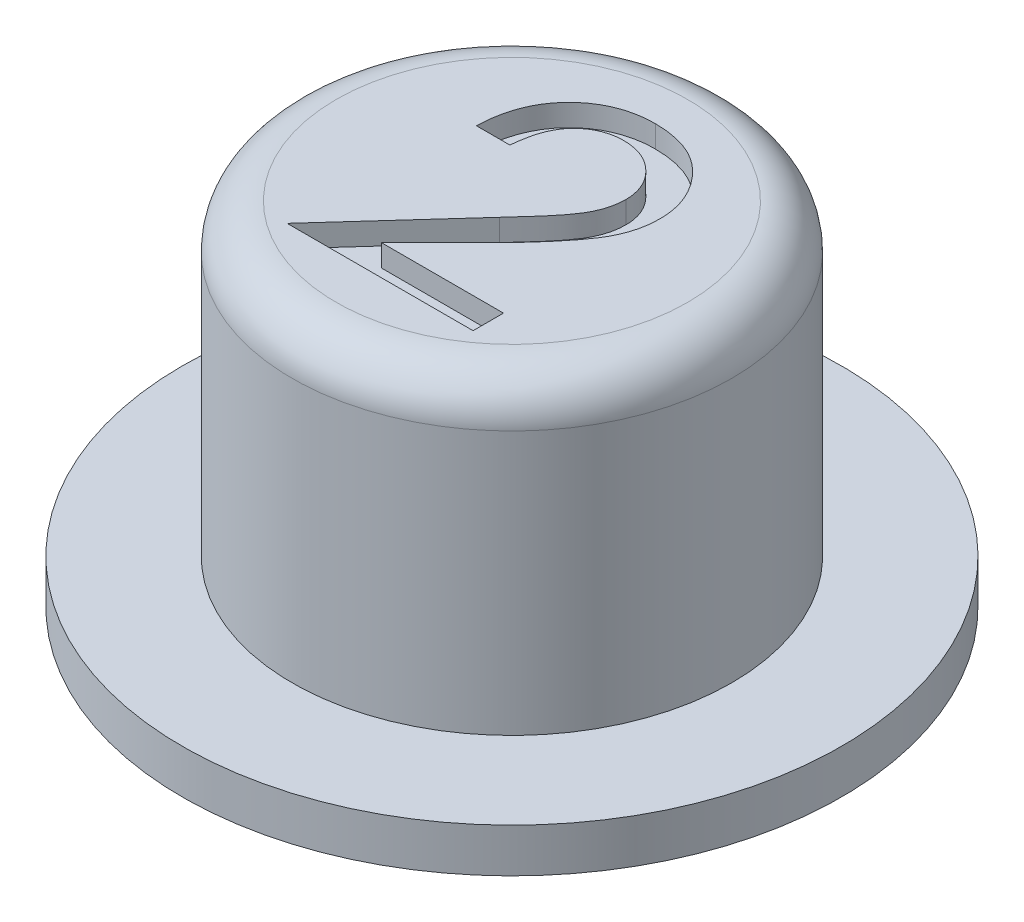
ISO-10303-21;
HEADER;
FILE_DESCRIPTION(('STEP AP214'),'2;1');
FILE_NAME('part.step','',(''),(''),'','','');
FILE_SCHEMA(('AUTOMOTIVE_DESIGN { 1 0 10303 214 1 1 1 1 }'));
ENDSEC;
DATA;
#1=APPLICATION_CONTEXT('core data for automotive mechanical design processes');
#2=APPLICATION_PROTOCOL_DEFINITION('international standard','automotive_design',2000,#1);
#3=PRODUCT_CONTEXT('',#1,'mechanical');
#4=PRODUCT('Part','Part','',(#3));
#5=PRODUCT_RELATED_PRODUCT_CATEGORY('part','',(#4));
#6=PRODUCT_DEFINITION_FORMATION('','',#4);
#7=PRODUCT_DEFINITION_CONTEXT('part definition',#1,'design');
#8=PRODUCT_DEFINITION('design','',#6,#7);
#9=PRODUCT_DEFINITION_SHAPE('','',#8);
#10=(LENGTH_UNIT() NAMED_UNIT(*) SI_UNIT(.MILLI.,.METRE.));
#11=(NAMED_UNIT(*) PLANE_ANGLE_UNIT() SI_UNIT($,.RADIAN.));
#12=(NAMED_UNIT(*) SI_UNIT($,.STERADIAN.) SOLID_ANGLE_UNIT());
#13=UNCERTAINTY_MEASURE_WITH_UNIT(LENGTH_MEASURE(1.E-05),#10,'distance_accuracy_value','');
#14=(GEOMETRIC_REPRESENTATION_CONTEXT(3) GLOBAL_UNCERTAINTY_ASSIGNED_CONTEXT((#13)) GLOBAL_UNIT_ASSIGNED_CONTEXT((#10,
#11,#12)) REPRESENTATION_CONTEXT('',''));
#15=CARTESIAN_POINT('',(0.,0.,0.));
#16=DIRECTION('',(0.,0.,1.));
#17=DIRECTION('',(1.,0.,0.));
#18=AXIS2_PLACEMENT_3D('',#15,#16,#17);
#19=CARTESIAN_POINT('',(-26.1010892072329,21.9206245299426,4.31572218298473));
#20=DIRECTION('',(0.,-1.,0.));
#21=DIRECTION('',(1.,0.,0.));
#22=AXIS2_PLACEMENT_3D('',#19,#20,#21);
#23=PLANE('',#22);
#24=CARTESIAN_POINT('',(-26.1010892072329,21.9206245299426,4.31572218298473));
#25=DIRECTION('',(0.,-1.,0.));
#26=DIRECTION('',(1.,0.,0.));
#27=AXIS2_PLACEMENT_3D('',#24,#25,#26);
#28=CIRCLE('',#27,3.99999999999999);
#29=CARTESIAN_POINT('',(-22.1010892072329,21.9206245299426,4.31572218298473));
#30=VERTEX_POINT('',#29);
#31=EDGE_CURVE('E40',#30,#30,#28,.F.);
#32=ORIENTED_EDGE('',*,*,#31,.T.);
#33=EDGE_LOOP('',(#32));
#34=FACE_BOUND('',#33,.T.);
#35=CARTESIAN_POINT('',(-26.0193584380021,21.9206245299426,1.85418372144627));
#36=CARTESIAN_POINT('',(-26.0582755167789,21.9206245299426,1.85498191818462));
#37=CARTESIAN_POINT('',(-26.1348356279358,21.9206245299426,1.85655218072575));
#38=CARTESIAN_POINT('',(-26.2475893421681,21.9206245299426,1.87275365429983));
#39=CARTESIAN_POINT('',(-26.3558189478942,21.9206245299426,1.89913283898827));
#40=CARTESIAN_POINT('',(-26.4598895510254,21.9206245299426,1.93572317449745));
#41=CARTESIAN_POINT('',(-26.5605549166993,21.9206245299426,1.98086505697451));
#42=CARTESIAN_POINT('',(-26.6553536082202,21.9206245299426,2.03934627794417));
#43=CARTESIAN_POINT('',(-26.7458350808816,21.9206245299426,2.10737795691741));
#44=CARTESIAN_POINT('',(-26.8331955215527,21.9206245299426,2.18373327550245));
#45=CARTESIAN_POINT('',(-26.9127035973751,21.9206245299426,2.27331326614867));
#46=CARTESIAN_POINT('',(-26.9838176662141,21.9206245299426,2.37505638584699));
#47=CARTESIAN_POINT('',(-27.0466141954329,21.9206245299426,2.4890734962762));
#48=CARTESIAN_POINT('',(-27.1002898021312,21.9206245299426,2.61516513865194));
#49=CARTESIAN_POINT('',(-27.1447734001177,21.9206245299426,2.75366211538844));
#50=CARTESIAN_POINT('',(-27.1804579830956,21.9206245299426,2.90439602033417));
#51=CARTESIAN_POINT('',(-27.2080456147565,21.9206245299426,3.06743245147312));
#52=CARTESIAN_POINT('',(-27.2191695418876,21.9206245299426,3.18062017254296));
#53=CARTESIAN_POINT('',(-27.224887284156,21.9206245299426,3.23879910606165));
#54=B_SPLINE_CURVE_WITH_KNOTS('',3,(#35,#36,#37,#38,#39,#40,#41,#42,#43,#44,#45,#46,#47,#48,#49,
#50,#51,#52,#53),.UNSPECIFIED.,.F.,.F.,(4,1,1,1,1,1,1,1,1,1,1,1,1,1,1,1,4),(0.,
0.056971305168592,0.112077514386116,0.166447640949922,0.219897905758325,0.273467231537103,
0.327713706604802,0.382641522400875,0.439172888127171,0.497361289307805,0.557599765805196,
0.620640083609898,0.68767803671055,0.758012520546467,0.833449835749434,0.914392560943234,1.),.UNSPECIFIED.);
#55=CARTESIAN_POINT('',(-26.0193584380021,21.9206245299426,1.85418372144627));
#56=VERTEX_POINT('',#55);
#57=CARTESIAN_POINT('',(-27.224887284156,21.9206245299426,3.23879910606165));
#58=VERTEX_POINT('',#57);
#59=EDGE_CURVE('E47',#56,#58,#54,.T.);
#60=ORIENTED_EDGE('',*,*,#59,.T.);
#61=DIRECTION('',(-1.,0.,0.));
#62=VECTOR('',#61,1.);
#63=CARTESIAN_POINT('',(-27.224887284156,21.9206245299426,3.23879910606165));
#64=LINE('',#63,#62);
#65=CARTESIAN_POINT('',(-27.9857045918483,21.9206245299426,3.23879910606165));
#66=VERTEX_POINT('',#65);
#67=EDGE_CURVE('E166',#58,#66,#64,.T.);
#68=ORIENTED_EDGE('',*,*,#67,.T.);
#69=CARTESIAN_POINT('',(-27.9857045918483,21.9206245299426,3.23879910606165));
#70=CARTESIAN_POINT('',(-27.9821308039579,21.9206245299426,3.16138185374569));
#71=CARTESIAN_POINT('',(-27.975140965187,21.9206245299426,3.0099643302751));
#72=CARTESIAN_POINT('',(-27.9441024771464,21.9206245299426,2.78933208114237));
#73=CARTESIAN_POINT('',(-27.8938223377863,21.9206245299426,2.58144022179686));
#74=CARTESIAN_POINT('',(-27.8303581875952,21.9206245299426,2.38452638379279));
#75=CARTESIAN_POINT('',(-27.7456987801849,21.9206245299426,2.20105209512091));
#76=CARTESIAN_POINT('',(-27.6480187585902,21.9206245299426,2.02781892835596));
#77=CARTESIAN_POINT('',(-27.5300965293352,21.9206245299426,1.86845751023403));
#78=CARTESIAN_POINT('',(-27.3968379678227,21.9206245299426,1.72271574480532));
#79=CARTESIAN_POINT('',(-27.2521810930825,21.9206245299426,1.59030367871183));
#80=CARTESIAN_POINT('',(-27.096674275807,21.9206245299426,1.47612726886941));
#81=CARTESIAN_POINT('',(-26.9329460590939,21.9206245299426,1.37883210891267));
#82=CARTESIAN_POINT('',(-26.7609642476145,21.9206245299426,1.2994386138784));
#83=CARTESIAN_POINT('',(-26.5803920334765,21.9206245299426,1.23796574651922));
#84=CARTESIAN_POINT('',(-26.3917441158973,21.9206245299426,1.19323348179878));
#85=CARTESIAN_POINT('',(-26.1944186868347,21.9206245299426,1.16632808714261));
#86=CARTESIAN_POINT('',(-26.0599069414178,21.9206245299426,1.16337376618238));
#87=CARTESIAN_POINT('',(-25.9917142072329,21.9206245299426,1.16187602913858));
#88=B_SPLINE_CURVE_WITH_KNOTS('',3,(#69,#70,#71,#72,#73,#74,#75,#76,#77,#78,#79,#80,#81,#82,#83,
#84,#85,#86,#87),.UNSPECIFIED.,.F.,.F.,(4,1,1,1,1,1,1,1,1,1,1,1,1,1,1,1,4),(0.,
0.0721852611632249,0.141184466632902,0.207190341816113,0.271289738720126,0.333603347161625,
0.395138342452934,0.456287150040092,0.517858367692974,0.578902257442721,0.638706565825344,
0.697285504225467,0.756078148420719,0.814867237218555,0.874716965274666,0.936485898250662,1.),.UNSPECIFIED.);
#89=CARTESIAN_POINT('',(-25.9917142072329,21.9206245299426,1.16187602913858));
#90=VERTEX_POINT('',#89);
#91=EDGE_CURVE('E433',#66,#90,#88,.T.);
#92=ORIENTED_EDGE('',*,*,#91,.T.);
#93=CARTESIAN_POINT('',(-25.9917142072329,21.9206245299426,1.16187602913858));
#94=CARTESIAN_POINT('',(-25.9203162677777,21.9206245299426,1.16333652173547));
#95=CARTESIAN_POINT('',(-25.7802137671539,21.9206245299426,1.16620241207529));
#96=CARTESIAN_POINT('',(-25.5761907823691,21.9206245299426,1.19317078965718));
#97=CARTESIAN_POINT('',(-25.3831017026507,21.9206245299426,1.23665727901487));
#98=CARTESIAN_POINT('',(-25.2008899918139,21.9206245299426,1.29604418982012));
#99=CARTESIAN_POINT('',(-25.0298876261484,21.9206245299426,1.3753411827545));
#100=CARTESIAN_POINT('',(-24.869757399903,21.9206245299426,1.47096461119033));
#101=CARTESIAN_POINT('',(-24.7220385631682,21.9206245299426,1.58590051894873));
#102=CARTESIAN_POINT('',(-24.5856589814255,21.9206245299426,1.71450662311232));
#103=CARTESIAN_POINT('',(-24.4652005456574,21.9206245299426,1.85597439688868));
#104=CARTESIAN_POINT('',(-24.3564018382087,21.9206245299426,2.00142007305526));
#105=CARTESIAN_POINT('',(-24.2664691729868,21.9206245299426,2.15379345563984));
#106=CARTESIAN_POINT('',(-24.191128268849,21.9206245299426,2.31031217265732));
#107=CARTESIAN_POINT('',(-24.1331522555622,21.9206245299426,2.47226083789307));
#108=CARTESIAN_POINT('',(-24.0922097764791,21.9206245299426,2.63898039194277));
#109=CARTESIAN_POINT('',(-24.0676681701537,21.9206245299426,2.81058412273981));
#110=CARTESIAN_POINT('',(-24.0643185020606,21.9206245299426,2.92662077640518));
#111=CARTESIAN_POINT('',(-24.0626276687714,21.9206245299426,2.98519333683089));
#112=B_SPLINE_CURVE_WITH_KNOTS('',3,(#93,#94,#95,#96,#97,#98,#99,#100,#101,#102,#103,#104,#105,
#106,#107,#108,#109,#110,#111),.UNSPECIFIED.,.F.,.F.,(4,1,1,1,1,1,1,1,1,1,1,1,1,1,1,1,4),(0.,
0.0722951466281054,0.141863069198498,0.208024753889536,0.272578644258576,0.335589612500515,
0.398578358569927,0.461082805887884,0.524813714924764,0.588114162474486,0.649073799790774,
0.7085828346307,0.767034895639372,0.824801028867428,0.882481561455874,0.940679469587159,1.),.UNSPECIFIED.);
#113=CARTESIAN_POINT('',(-24.0626276687714,21.9206245299426,2.98519333683089));
#114=VERTEX_POINT('',#113);
#115=EDGE_CURVE('E387',#90,#114,#112,.T.);
#116=ORIENTED_EDGE('',*,*,#115,.T.);
#117=CARTESIAN_POINT('',(-24.0626276687714,21.9206245299426,2.98519333683089));
#118=CARTESIAN_POINT('',(-24.0657044740288,21.9206245299426,3.06712673704674));
#119=CARTESIAN_POINT('',(-24.0718159347894,21.9206245299426,3.22987111587288));
#120=CARTESIAN_POINT('',(-24.1188760751631,21.9206245299426,3.47064208420863));
#121=CARTESIAN_POINT('',(-24.1979896848137,21.9206245299426,3.70365810678221));
#122=CARTESIAN_POINT('',(-24.2893734723238,21.9206245299426,3.8933942627536));
#123=CARTESIAN_POINT('',(-24.3817971489555,21.9206245299426,4.04676070181318));
#124=CARTESIAN_POINT('',(-24.4666137241997,21.9206245299426,4.17335092387227));
#125=CARTESIAN_POINT('',(-24.5662512558922,21.9206245299426,4.3102333819659));
#126=CARTESIAN_POINT('',(-24.6828465217016,21.9206245299426,4.45649177554107));
#127=CARTESIAN_POINT('',(-24.8117632198333,21.9206245299426,4.61547255279153));
#128=CARTESIAN_POINT('',(-24.9581224280405,21.9206245299426,4.78307450320234));
#129=CARTESIAN_POINT('',(-25.1173941072745,21.9206245299426,4.96269084577654));
#130=CARTESIAN_POINT('',(-25.2309841912753,21.9206245299426,5.0836361862481));
#131=CARTESIAN_POINT('',(-25.2897911303098,21.9206245299426,5.14625102913858));
#132=B_SPLINE_CURVE_WITH_KNOTS('',3,(#117,#118,#119,#120,#121,#122,#123,#124,#125,#126,#127,
#128,#129,#130,#131),.UNSPECIFIED.,.F.,.F.,(4,1,1,1,1,1,1,1,1,1,1,1,4),(0.,0.0963129234548142,
0.191306437414885,0.287260269542858,0.385041783312048,0.438291931212014,0.49775044955736,
0.56419160247439,0.637336305933295,0.717694708156951,0.804880874567301,0.898984505428149,1.),.UNSPECIFIED.);
#133=CARTESIAN_POINT('',(-25.2897911303098,21.9206245299426,5.14625102913858));
#134=VERTEX_POINT('',#133);
#135=EDGE_CURVE('E384',#114,#134,#132,.T.);
#136=ORIENTED_EDGE('',*,*,#135,.T.);
#137=DIRECTION('',(-0.706818929896772,0.,0.707394515344572));
#138=VECTOR('',#137,1.);
#139=CARTESIAN_POINT('',(-25.2897911303098,21.9206245299426,5.14625102913858));
#140=LINE('',#139,#138);
#141=CARTESIAN_POINT('',(-26.7657526687714,21.9206245299426,6.62341449067704));
#142=VERTEX_POINT('',#141);
#143=EDGE_CURVE('E378',#134,#142,#140,.T.);
#144=ORIENTED_EDGE('',*,*,#143,.T.);
#145=DIRECTION('',(1.,0.,0.));
#146=VECTOR('',#145,1.);
#147=CARTESIAN_POINT('',(-26.7657526687714,21.9206245299426,6.62341449067704));
#148=LINE('',#147,#146);
#149=CARTESIAN_POINT('',(-23.9857045918483,21.9206245299426,6.62341449067704));
#150=VERTEX_POINT('',#149);
#151=EDGE_CURVE('E369',#142,#150,#148,.T.);
#152=ORIENTED_EDGE('',*,*,#151,.T.);
#153=DIRECTION('',(0.,0.,1.));
#154=VECTOR('',#153,1.);
#155=CARTESIAN_POINT('',(-23.9857045918483,21.9206245299426,6.62341449067704));
#156=LINE('',#155,#154);
#157=CARTESIAN_POINT('',(-23.9857045918483,21.9206245299426,7.31572218298473));
#158=VERTEX_POINT('',#157);
#159=EDGE_CURVE('E377',#150,#158,#156,.T.);
#160=ORIENTED_EDGE('',*,*,#159,.T.);
#161=DIRECTION('',(-1.,0.,0.));
#162=VECTOR('',#161,1.);
#163=CARTESIAN_POINT('',(-23.9857045918483,21.9206245299426,7.31572218298473));
#164=LINE('',#163,#162);
#165=CARTESIAN_POINT('',(-28.2164738226175,21.9206245299426,7.31572218298473));
#166=VERTEX_POINT('',#165);
#167=EDGE_CURVE('E394',#158,#166,#164,.T.);
#168=ORIENTED_EDGE('',*,*,#167,.T.);
#169=DIRECTION('',(0.671272146490602,0.,-0.74121097222444));
#170=VECTOR('',#169,1.);
#171=CARTESIAN_POINT('',(-28.2164738226175,21.9206245299426,7.31572218298473));
#172=LINE('',#171,#170);
#173=CARTESIAN_POINT('',(-25.9208007456945,21.9206245299426,4.78086641375396));
#174=VERTEX_POINT('',#173);
#175=EDGE_CURVE('E397',#166,#174,#172,.T.);
#176=ORIENTED_EDGE('',*,*,#175,.T.);
#177=CARTESIAN_POINT('',(-25.9208007456945,21.9206245299426,4.78086641375396));
#178=CARTESIAN_POINT('',(-25.8661208561587,21.9206245299426,4.72255092408251));
#179=CARTESIAN_POINT('',(-25.7611891487214,21.9206245299426,4.61064243353479));
#180=CARTESIAN_POINT('',(-25.6133027631757,21.9206245299426,4.44682637318312));
#181=CARTESIAN_POINT('',(-25.4798761356293,21.9206245299426,4.29538098157737));
#182=CARTESIAN_POINT('',(-25.3601979179476,21.9206245299426,4.15641558706945));
#183=CARTESIAN_POINT('',(-25.2574019943221,21.9206245299426,4.02806234728525));
#184=CARTESIAN_POINT('',(-25.1687229492733,21.9206245299426,3.91220956190239));
#185=CARTESIAN_POINT('',(-25.0951646468532,21.9206245299426,3.80831015210134));
#186=CARTESIAN_POINT('',(-25.0187739993431,21.9206245299426,3.6860118980799));
#187=CARTESIAN_POINT('',(-24.9430787033577,21.9206245299426,3.53940954767831));
#188=CARTESIAN_POINT('',(-24.8786860843143,21.9206245299426,3.3605752655754));
#189=CARTESIAN_POINT('',(-24.8400473585855,21.9206245299426,3.17794667086376));
#190=CARTESIAN_POINT('',(-24.8345894139076,21.9206245299426,3.05508349057558));
#191=CARTESIAN_POINT('',(-24.8318584380021,21.9206245299426,2.99360679836935));
#192=B_SPLINE_CURVE_WITH_KNOTS('',3,(#177,#178,#179,#180,#181,#182,#183,#184,#185,#186,#187,
#188,#189,#190,#191),.UNSPECIFIED.,.F.,.F.,(4,1,1,1,1,1,1,1,1,1,1,1,4),(0.,0.111796703885442,
0.214539918133528,0.308625582047602,0.394072981184506,0.470989580125928,0.538563461408386,
0.598097997336716,0.648937472604036,0.74014971500445,0.828231221971265,0.914052556081116,1.),.UNSPECIFIED.);
#193=CARTESIAN_POINT('',(-24.8318584380021,21.9206245299426,2.99360679836935));
#194=VERTEX_POINT('',#193);
#195=EDGE_CURVE('E400',#174,#194,#192,.T.);
#196=ORIENTED_EDGE('',*,*,#195,.T.);
#197=CARTESIAN_POINT('',(-24.8318584380021,21.9206245299426,2.99360679836935));
#198=CARTESIAN_POINT('',(-24.8325314651676,21.9206245299426,2.95546898620591));
#199=CARTESIAN_POINT('',(-24.8338631857231,21.9206245299426,2.88000560075582));
#200=CARTESIAN_POINT('',(-24.8520190031721,21.9206245299426,2.7694985221867));
#201=CARTESIAN_POINT('',(-24.8775947325468,21.9206245299426,2.66231280514387));
#202=CARTESIAN_POINT('',(-24.9171514407717,21.9206245299426,2.56017167313224));
#203=CARTESIAN_POINT('',(-24.964809996028,21.9206245299426,2.46106560955968));
#204=CARTESIAN_POINT('',(-25.0244223694315,21.9206245299426,2.36627577752009));
#205=CARTESIAN_POINT('',(-25.0960062299675,21.9206245299426,2.27668145501108));
#206=CARTESIAN_POINT('',(-25.1756365384349,21.9206245299426,2.19026682590632));
#207=CARTESIAN_POINT('',(-25.2637097524835,21.9206245299426,2.1122442032022));
#208=CARTESIAN_POINT('',(-25.3567361139624,21.9206245299426,2.04226932282453));
#209=CARTESIAN_POINT('',(-25.4558596225999,21.9206245299426,1.98544061707196));
#210=CARTESIAN_POINT('',(-25.5583700927858,21.9206245299426,1.93574291917736));
#211=CARTESIAN_POINT('',(-25.667454123268,21.9206245299426,1.90051050259747));
#212=CARTESIAN_POINT('',(-25.7804302986008,21.9206245299426,1.87427815734896));
#213=CARTESIAN_POINT('',(-25.8981857077914,21.9206245299426,1.8561064823715));
#214=CARTESIAN_POINT('',(-25.9784230374959,21.9206245299426,1.85483328169316));
#215=CARTESIAN_POINT('',(-26.0193584380021,21.9206245299426,1.85418372144627));
#216=B_SPLINE_CURVE_WITH_KNOTS('',3,(#197,#198,#199,#200,#201,#202,#203,#204,#205,#206,#207,
#208,#209,#210,#211,#212,#213,#214,#215),.UNSPECIFIED.,.F.,.F.,(4,1,1,1,1,1,1,1,1,1,1,1,1,1,1,1,
4),(0.,0.0624645579460314,0.123598778898253,0.183188668078302,0.242854553261223,
0.302791066145277,0.363304438937391,0.425993138279141,0.490604073915262,0.55574386647325,
0.618679913682443,0.681099546765629,0.742813418463334,0.80513618031387,0.868557225128491,
0.932940656763705,1.),.UNSPECIFIED.);
#217=EDGE_CURVE('E162',#194,#56,#216,.T.);
#218=ORIENTED_EDGE('',*,*,#217,.T.);
#219=EDGE_LOOP('',(#60,#68,#92,#116,#136,#144,#152,#160,#168,#176,#196,#218));
#220=FACE_BOUND('',#219,.T.);
#221=ADVANCED_FACE('F32',(#34,#220),#23,.F.);
#222=CARTESIAN_POINT('',(-26.1010892072329,13.9206245299426,4.31572218298473));
#223=DIRECTION('',(0.,1.,0.));
#224=DIRECTION('',(-1.,0.,0.));
#225=AXIS2_PLACEMENT_3D('',#222,#223,#224);
#226=PLANE('',#225);
#227=CARTESIAN_POINT('',(-26.1010892072329,13.9206245299426,4.31572218298473));
#228=DIRECTION('',(0.,1.,0.));
#229=DIRECTION('',(-1.,0.,0.));
#230=AXIS2_PLACEMENT_3D('',#227,#228,#229);
#231=CIRCLE('',#230,7.49999999999998);
#232=CARTESIAN_POINT('',(-33.6010892072329,13.9206245299426,4.31572218298473));
#233=VERTEX_POINT('',#232);
#234=EDGE_CURVE('E208',#233,#233,#231,.T.);
#235=ORIENTED_EDGE('',*,*,#234,.F.);
#236=EDGE_LOOP('',(#235));
#237=FACE_BOUND('',#236,.T.);
#238=DIRECTION('',(0.,0.,1.));
#239=VECTOR('',#238,1.);
#240=CARTESIAN_POINT('',(-27.3510892072329,13.9206245299426,2.56572218298473));
#241=LINE('',#240,#239);
#242=CARTESIAN_POINT('',(-27.3510892072329,13.9206245299426,2.56572218298473));
#243=VERTEX_POINT('',#242);
#244=CARTESIAN_POINT('',(-27.3510892072329,13.9206245299426,6.06572218298473));
#245=VERTEX_POINT('',#244);
#246=EDGE_CURVE('E55',#243,#245,#241,.T.);
#247=ORIENTED_EDGE('',*,*,#246,.T.);
#248=DIRECTION('',(1.,0.,0.));
#249=VECTOR('',#248,1.);
#250=CARTESIAN_POINT('',(-27.3510892072329,13.9206245299426,6.06572218298473));
#251=LINE('',#250,#249);
#252=CARTESIAN_POINT('',(-24.8510892072329,13.9206245299426,6.06572218298473));
#253=VERTEX_POINT('',#252);
#254=EDGE_CURVE('E169',#245,#253,#251,.T.);
#255=ORIENTED_EDGE('',*,*,#254,.T.);
#256=DIRECTION('',(0.,0.,1.));
#257=VECTOR('',#256,1.);
#258=CARTESIAN_POINT('',(-24.8510892072329,13.9206245299426,2.56572218298473));
#259=LINE('',#258,#257);
#260=CARTESIAN_POINT('',(-24.8510892072329,13.9206245299426,2.56572218298473));
#261=VERTEX_POINT('',#260);
#262=EDGE_CURVE('E190',#261,#253,#259,.T.);
#263=ORIENTED_EDGE('',*,*,#262,.F.);
#264=DIRECTION('',(1.,0.,0.));
#265=VECTOR('',#264,1.);
#266=CARTESIAN_POINT('',(-27.3510892072329,13.9206245299426,2.56572218298473));
#267=LINE('',#266,#265);
#268=EDGE_CURVE('E179',#243,#261,#267,.T.);
#269=ORIENTED_EDGE('',*,*,#268,.F.);
#270=EDGE_LOOP('',(#247,#255,#263,#269));
#271=FACE_BOUND('',#270,.T.);
#272=ADVANCED_FACE('F228',(#237,#271),#226,.F.);
#273=CARTESIAN_POINT('',(-26.1010892072329,21.9206245299426,4.31572218298473));
#274=DIRECTION('',(0.,1.,0.));
#275=DIRECTION('',(-1.,0.,0.));
#276=AXIS2_PLACEMENT_3D('',#273,#274,#275);
#277=CYLINDRICAL_SURFACE('',#276,7.49999999999998);
#278=CARTESIAN_POINT('',(-26.1010892072329,14.9206245299426,4.31572218298473));
#279=DIRECTION('',(0.,1.,0.));
#280=DIRECTION('',(-1.,0.,0.));
#281=AXIS2_PLACEMENT_3D('',#278,#279,#280);
#282=CIRCLE('',#281,7.49999999999998);
#283=CARTESIAN_POINT('',(-33.6010892072329,14.9206245299426,4.31572218298473));
#284=VERTEX_POINT('',#283);
#285=EDGE_CURVE('E205',#284,#284,#282,.T.);
#286=ORIENTED_EDGE('',*,*,#285,.F.);
#287=EDGE_LOOP('',(#286));
#288=FACE_BOUND('',#287,.T.);
#289=ORIENTED_EDGE('',*,*,#234,.T.);
#290=EDGE_LOOP('',(#289));
#291=FACE_BOUND('',#290,.T.);
#292=ADVANCED_FACE('F233',(#288,#291),#277,.T.);
#293=CARTESIAN_POINT('',(-21.1010892072329,14.9206245299426,4.31572218298473));
#294=DIRECTION('',(0.,-1.,0.));
#295=DIRECTION('',(1.,0.,0.));
#296=AXIS2_PLACEMENT_3D('',#293,#294,#295);
#297=PLANE('',#296);
#298=CARTESIAN_POINT('',(-26.1010892072329,14.9206245299426,4.31572218298473));
#299=DIRECTION('',(0.,1.,0.));
#300=DIRECTION('',(-1.,0.,0.));
#301=AXIS2_PLACEMENT_3D('',#298,#299,#300);
#302=CIRCLE('',#301,4.99999999999998);
#303=CARTESIAN_POINT('',(-31.1010892072329,14.9206245299426,4.31572218298473));
#304=VERTEX_POINT('',#303);
#305=EDGE_CURVE('E202',#304,#304,#302,.T.);
#306=ORIENTED_EDGE('',*,*,#305,.F.);
#307=EDGE_LOOP('',(#306));
#308=FACE_BOUND('',#307,.T.);
#309=ORIENTED_EDGE('',*,*,#285,.T.);
#310=EDGE_LOOP('',(#309));
#311=FACE_BOUND('',#310,.T.);
#312=ADVANCED_FACE('F242',(#308,#311),#297,.F.);
#313=CARTESIAN_POINT('',(-26.1010892072329,21.9206245299426,4.31572218298473));
#314=DIRECTION('',(0.,1.,0.));
#315=DIRECTION('',(-1.,0.,0.));
#316=AXIS2_PLACEMENT_3D('',#313,#314,#315);
#317=CYLINDRICAL_SURFACE('',#316,4.99999999999999);
#318=CARTESIAN_POINT('',(-26.1010892072329,20.9206245299426,4.31572218298473));
#319=DIRECTION('',(0.,-1.,0.));
#320=DIRECTION('',(1.,0.,0.));
#321=AXIS2_PLACEMENT_3D('',#318,#319,#320);
#322=CIRCLE('',#321,4.99999999999999);
#323=CARTESIAN_POINT('',(-21.1010892072329,20.9206245299426,4.31572218298473));
#324=VERTEX_POINT('',#323);
#325=EDGE_CURVE('E11',#324,#324,#322,.T.);
#326=ORIENTED_EDGE('',*,*,#325,.T.);
#327=EDGE_LOOP('',(#326));
#328=FACE_BOUND('',#327,.T.);
#329=ORIENTED_EDGE('',*,*,#305,.T.);
#330=EDGE_LOOP('',(#329));
#331=FACE_BOUND('',#330,.T.);
#332=ADVANCED_FACE('F239',(#328,#331),#317,.T.);
#333=CARTESIAN_POINT('',(-27.3510892072329,17.4206245299426,2.56572218298473));
#334=DIRECTION('',(1.,0.,0.));
#335=DIRECTION('',(0.,1.,0.));
#336=AXIS2_PLACEMENT_3D('',#333,#334,#335);
#337=PLANE('',#336);
#338=ORIENTED_EDGE('',*,*,#246,.F.);
#339=DIRECTION('',(0.,-1.,0.));
#340=VECTOR('',#339,1.);
#341=CARTESIAN_POINT('',(-27.3510892072329,17.4206245299426,2.56572218298473));
#342=LINE('',#341,#340);
#343=CARTESIAN_POINT('',(-27.3510892072329,17.4206245299426,2.56572218298473));
#344=VERTEX_POINT('',#343);
#345=EDGE_CURVE('E186',#344,#243,#342,.T.);
#346=ORIENTED_EDGE('',*,*,#345,.F.);
#347=DIRECTION('',(0.,0.,1.));
#348=VECTOR('',#347,1.);
#349=CARTESIAN_POINT('',(-27.3510892072329,17.4206245299426,2.56572218298473));
#350=LINE('',#349,#348);
#351=CARTESIAN_POINT('',(-27.3510892072329,17.4206245299426,6.06572218298473));
#352=VERTEX_POINT('',#351);
#353=EDGE_CURVE('E175',#344,#352,#350,.T.);
#354=ORIENTED_EDGE('',*,*,#353,.T.);
#355=DIRECTION('',(0.,-1.,0.));
#356=VECTOR('',#355,1.);
#357=CARTESIAN_POINT('',(-27.3510892072329,17.4206245299426,6.06572218298473));
#358=LINE('',#357,#356);
#359=EDGE_CURVE('E200',#352,#245,#358,.T.);
#360=ORIENTED_EDGE('',*,*,#359,.T.);
#361=EDGE_LOOP('',(#338,#346,#354,#360));
#362=FACE_BOUND('',#361,.T.);
#363=ADVANCED_FACE('F237',(#362),#337,.T.);
#364=CARTESIAN_POINT('',(-27.3510892072329,17.4206245299426,6.06572218298473));
#365=DIRECTION('',(0.,0.,-1.));
#366=DIRECTION('',(-1.,0.,0.));
#367=AXIS2_PLACEMENT_3D('',#364,#365,#366);
#368=PLANE('',#367);
#369=ORIENTED_EDGE('',*,*,#254,.F.);
#370=ORIENTED_EDGE('',*,*,#359,.F.);
#371=DIRECTION('',(1.,0.,0.));
#372=VECTOR('',#371,1.);
#373=CARTESIAN_POINT('',(-27.3510892072329,17.4206245299426,6.06572218298473));
#374=LINE('',#373,#372);
#375=CARTESIAN_POINT('',(-24.8510892072329,17.4206245299426,6.06572218298473));
#376=VERTEX_POINT('',#375);
#377=EDGE_CURVE('E178',#352,#376,#374,.T.);
#378=ORIENTED_EDGE('',*,*,#377,.T.);
#379=DIRECTION('',(0.,-1.,0.));
#380=VECTOR('',#379,1.);
#381=CARTESIAN_POINT('',(-24.8510892072329,17.4206245299426,6.06572218298473));
#382=LINE('',#381,#380);
#383=EDGE_CURVE('E198',#376,#253,#382,.T.);
#384=ORIENTED_EDGE('',*,*,#383,.T.);
#385=EDGE_LOOP('',(#369,#370,#378,#384));
#386=FACE_BOUND('',#385,.T.);
#387=ADVANCED_FACE('F264',(#386),#368,.T.);
#388=CARTESIAN_POINT('',(-24.8510892072329,17.4206245299426,2.56572218298473));
#389=DIRECTION('',(1.,0.,0.));
#390=DIRECTION('',(0.,1.,0.));
#391=AXIS2_PLACEMENT_3D('',#388,#389,#390);
#392=PLANE('',#391);
#393=ORIENTED_EDGE('',*,*,#262,.T.);
#394=ORIENTED_EDGE('',*,*,#383,.F.);
#395=DIRECTION('',(0.,0.,1.));
#396=VECTOR('',#395,1.);
#397=CARTESIAN_POINT('',(-24.8510892072329,17.4206245299426,2.56572218298473));
#398=LINE('',#397,#396);
#399=CARTESIAN_POINT('',(-24.8510892072329,17.4206245299426,2.56572218298473));
#400=VERTEX_POINT('',#399);
#401=EDGE_CURVE('E181',#400,#376,#398,.T.);
#402=ORIENTED_EDGE('',*,*,#401,.F.);
#403=DIRECTION('',(0.,-1.,0.));
#404=VECTOR('',#403,1.);
#405=CARTESIAN_POINT('',(-24.8510892072329,17.4206245299426,2.56572218298473));
#406=LINE('',#405,#404);
#407=EDGE_CURVE('E196',#400,#261,#406,.T.);
#408=ORIENTED_EDGE('',*,*,#407,.T.);
#409=EDGE_LOOP('',(#393,#394,#402,#408));
#410=FACE_BOUND('',#409,.T.);
#411=ADVANCED_FACE('F266',(#410),#392,.F.);
#412=CARTESIAN_POINT('',(-27.3510892072329,17.4206245299426,2.56572218298473));
#413=DIRECTION('',(0.,0.,-1.));
#414=DIRECTION('',(-1.,0.,0.));
#415=AXIS2_PLACEMENT_3D('',#412,#413,#414);
#416=PLANE('',#415);
#417=ORIENTED_EDGE('',*,*,#268,.T.);
#418=ORIENTED_EDGE('',*,*,#407,.F.);
#419=DIRECTION('',(1.,0.,0.));
#420=VECTOR('',#419,1.);
#421=CARTESIAN_POINT('',(-27.3510892072329,17.4206245299426,2.56572218298473));
#422=LINE('',#421,#420);
#423=EDGE_CURVE('E184',#344,#400,#422,.T.);
#424=ORIENTED_EDGE('',*,*,#423,.F.);
#425=ORIENTED_EDGE('',*,*,#345,.T.);
#426=EDGE_LOOP('',(#417,#418,#424,#425));
#427=FACE_BOUND('',#426,.T.);
#428=ADVANCED_FACE('F223',(#427),#416,.F.);
#429=CARTESIAN_POINT('',(-26.1010892072329,17.4206245299426,4.31572218298473));
#430=DIRECTION('',(0.,1.,0.));
#431=DIRECTION('',(-1.,0.,0.));
#432=AXIS2_PLACEMENT_3D('',#429,#430,#431);
#433=PLANE('',#432);
#434=ORIENTED_EDGE('',*,*,#353,.F.);
#435=ORIENTED_EDGE('',*,*,#423,.T.);
#436=ORIENTED_EDGE('',*,*,#401,.T.);
#437=ORIENTED_EDGE('',*,*,#377,.F.);
#438=EDGE_LOOP('',(#434,#435,#436,#437));
#439=FACE_BOUND('',#438,.T.);
#440=ADVANCED_FACE('F216',(#439),#433,.F.);
#441=CARTESIAN_POINT('',(-26.1010892072329,20.9206245299426,4.31572218298473));
#442=DIRECTION('',(0.,-1.,0.));
#443=DIRECTION('',(1.,0.,0.));
#444=AXIS2_PLACEMENT_3D('',#441,#442,#443);
#445=TOROIDAL_SURFACE('',#444,3.99999999999999,1.);
#446=ORIENTED_EDGE('',*,*,#325,.F.);
#447=EDGE_LOOP('',(#446));
#448=FACE_BOUND('',#447,.T.);
#449=ORIENTED_EDGE('',*,*,#31,.F.);
#450=EDGE_LOOP('',(#449));
#451=FACE_BOUND('',#450,.T.);
#452=ADVANCED_FACE('F34',(#448,#451),#445,.T.);
#453=CARTESIAN_POINT('',(-26.0193584380021,21.4206245299426,1.85418372144627));
#454=CARTESIAN_POINT('',(-26.0582755167789,21.4206245299426,1.85498191818462));
#455=CARTESIAN_POINT('',(-26.1348356279358,21.4206245299426,1.85655218072575));
#456=CARTESIAN_POINT('',(-26.2475893421681,21.4206245299426,1.87275365429983));
#457=CARTESIAN_POINT('',(-26.3558189478942,21.4206245299426,1.89913283898827));
#458=CARTESIAN_POINT('',(-26.4598895510254,21.4206245299426,1.93572317449745));
#459=CARTESIAN_POINT('',(-26.5605549166993,21.4206245299426,1.98086505697451));
#460=CARTESIAN_POINT('',(-26.6553536082202,21.4206245299426,2.03934627794417));
#461=CARTESIAN_POINT('',(-26.7458350808816,21.4206245299426,2.10737795691741));
#462=CARTESIAN_POINT('',(-26.8331955215527,21.4206245299426,2.18373327550245));
#463=CARTESIAN_POINT('',(-26.9127035973751,21.4206245299426,2.27331326614867));
#464=CARTESIAN_POINT('',(-26.9838176662141,21.4206245299426,2.37505638584699));
#465=CARTESIAN_POINT('',(-27.0466141954329,21.4206245299426,2.4890734962762));
#466=CARTESIAN_POINT('',(-27.1002898021312,21.4206245299426,2.61516513865194));
#467=CARTESIAN_POINT('',(-27.1447734001177,21.4206245299426,2.75366211538844));
#468=CARTESIAN_POINT('',(-27.1804579830956,21.4206245299426,2.90439602033417));
#469=CARTESIAN_POINT('',(-27.2080456147565,21.4206245299426,3.06743245147312));
#470=CARTESIAN_POINT('',(-27.2191695418876,21.4206245299426,3.18062017254296));
#471=CARTESIAN_POINT('',(-27.224887284156,21.4206245299426,3.23879910606165));
#472=B_SPLINE_CURVE_WITH_KNOTS('',3,(#453,#454,#455,#456,#457,#458,#459,#460,#461,#462,#463,
#464,#465,#466,#467,#468,#469,#470,#471),.UNSPECIFIED.,.F.,.F.,(4,1,1,1,1,1,1,1,1,1,1,1,1,1,1,1,
4),(0.,0.056971305168592,0.112077514386116,0.166447640949922,0.219897905758325,
0.273467231537103,0.327713706604802,0.382641522400875,0.439172888127171,0.497361289307805,
0.557599765805196,0.620640083609898,0.68767803671055,0.758012520546467,0.833449835749434,
0.914392560943234,1.),.UNSPECIFIED.);
#473=DIRECTION('',(0.,1.,0.));
#474=VECTOR('',#473,1.);
#475=SURFACE_OF_LINEAR_EXTRUSION('',#472,#474);
#476=ORIENTED_EDGE('',*,*,#59,.F.);
#477=DIRECTION('',(0.,1.,0.));
#478=VECTOR('',#477,1.);
#479=CARTESIAN_POINT('',(-26.0193584380021,21.4206245299426,1.85418372144627));
#480=LINE('',#479,#478);
#481=CARTESIAN_POINT('',(-26.0193584380021,21.4206245299426,1.85418372144627));
#482=VERTEX_POINT('',#481);
#483=EDGE_CURVE('E161',#482,#56,#480,.T.);
#484=ORIENTED_EDGE('',*,*,#483,.F.);
#485=CARTESIAN_POINT('',(-27.224887284156,21.4206245299426,3.23879910606165));
#486=VERTEX_POINT('',#485);
#487=EDGE_CURVE('E152',#482,#486,#472,.T.);
#488=ORIENTED_EDGE('',*,*,#487,.T.);
#489=DIRECTION('',(0.,1.,0.));
#490=VECTOR('',#489,1.);
#491=CARTESIAN_POINT('',(-27.224887284156,21.4206245299426,3.23879910606165));
#492=LINE('',#491,#490);
#493=EDGE_CURVE('E160',#486,#58,#492,.T.);
#494=ORIENTED_EDGE('',*,*,#493,.T.);
#495=EDGE_LOOP('',(#476,#484,#488,#494));
#496=FACE_BOUND('',#495,.T.);
#497=ADVANCED_FACE('F159',(#496),#475,.T.);
#498=CARTESIAN_POINT('',(-27.224887284156,21.4206245299426,3.23879910606165));
#499=DIRECTION('',(0.,0.,-1.));
#500=DIRECTION('',(-1.,0.,0.));
#501=AXIS2_PLACEMENT_3D('',#498,#499,#500);
#502=PLANE('',#501);
#503=ORIENTED_EDGE('',*,*,#67,.F.);
#504=ORIENTED_EDGE('',*,*,#493,.F.);
#505=DIRECTION('',(-1.,0.,0.));
#506=VECTOR('',#505,1.);
#507=CARTESIAN_POINT('',(-27.224887284156,21.4206245299426,3.23879910606165));
#508=LINE('',#507,#506);
#509=CARTESIAN_POINT('',(-27.9857045918483,21.4206245299426,3.23879910606165));
#510=VERTEX_POINT('',#509);
#511=EDGE_CURVE('E148',#486,#510,#508,.T.);
#512=ORIENTED_EDGE('',*,*,#511,.T.);
#513=DIRECTION('',(0.,1.,0.));
#514=VECTOR('',#513,1.);
#515=CARTESIAN_POINT('',(-27.9857045918483,21.4206245299426,3.23879910606165));
#516=LINE('',#515,#514);
#517=EDGE_CURVE('E167',#510,#66,#516,.T.);
#518=ORIENTED_EDGE('',*,*,#517,.T.);
#519=EDGE_LOOP('',(#503,#504,#512,#518));
#520=FACE_BOUND('',#519,.T.);
#521=ADVANCED_FACE('F164',(#520),#502,.T.);
#522=CARTESIAN_POINT('',(-27.9857045918483,21.4206245299426,3.23879910606165));
#523=CARTESIAN_POINT('',(-27.9821308039579,21.4206245299426,3.16138185374569));
#524=CARTESIAN_POINT('',(-27.975140965187,21.4206245299426,3.0099643302751));
#525=CARTESIAN_POINT('',(-27.9441024771464,21.4206245299426,2.78933208114237));
#526=CARTESIAN_POINT('',(-27.8938223377863,21.4206245299426,2.58144022179686));
#527=CARTESIAN_POINT('',(-27.8303581875952,21.4206245299426,2.38452638379279));
#528=CARTESIAN_POINT('',(-27.7456987801849,21.4206245299426,2.20105209512091));
#529=CARTESIAN_POINT('',(-27.6480187585902,21.4206245299426,2.02781892835596));
#530=CARTESIAN_POINT('',(-27.5300965293352,21.4206245299426,1.86845751023403));
#531=CARTESIAN_POINT('',(-27.3968379678227,21.4206245299426,1.72271574480532));
#532=CARTESIAN_POINT('',(-27.2521810930825,21.4206245299426,1.59030367871183));
#533=CARTESIAN_POINT('',(-27.096674275807,21.4206245299426,1.47612726886941));
#534=CARTESIAN_POINT('',(-26.9329460590939,21.4206245299426,1.37883210891267));
#535=CARTESIAN_POINT('',(-26.7609642476145,21.4206245299426,1.2994386138784));
#536=CARTESIAN_POINT('',(-26.5803920334765,21.4206245299426,1.23796574651922));
#537=CARTESIAN_POINT('',(-26.3917441158973,21.4206245299426,1.19323348179878));
#538=CARTESIAN_POINT('',(-26.1944186868347,21.4206245299426,1.16632808714261));
#539=CARTESIAN_POINT('',(-26.0599069414178,21.4206245299426,1.16337376618238));
#540=CARTESIAN_POINT('',(-25.9917142072329,21.4206245299426,1.16187602913858));
#541=B_SPLINE_CURVE_WITH_KNOTS('',3,(#522,#523,#524,#525,#526,#527,#528,#529,#530,#531,#532,
#533,#534,#535,#536,#537,#538,#539,#540),.UNSPECIFIED.,.F.,.F.,(4,1,1,1,1,1,1,1,1,1,1,1,1,1,1,1,
4),(0.,0.0721852611632249,0.141184466632902,0.207190341816113,0.271289738720126,
0.333603347161625,0.395138342452934,0.456287150040092,0.517858367692974,0.578902257442721,
0.638706565825344,0.697285504225467,0.756078148420719,0.814867237218555,0.874716965274666,
0.936485898250662,1.),.UNSPECIFIED.);
#542=DIRECTION('',(0.,1.,0.));
#543=VECTOR('',#542,1.);
#544=SURFACE_OF_LINEAR_EXTRUSION('',#541,#543);
#545=ORIENTED_EDGE('',*,*,#91,.F.);
#546=ORIENTED_EDGE('',*,*,#517,.F.);
#547=CARTESIAN_POINT('',(-25.9917142072329,21.4206245299426,1.16187602913858));
#548=VERTEX_POINT('',#547);
#549=EDGE_CURVE('E154',#510,#548,#541,.T.);
#550=ORIENTED_EDGE('',*,*,#549,.T.);
#551=DIRECTION('',(0.,1.,0.));
#552=VECTOR('',#551,1.);
#553=CARTESIAN_POINT('',(-25.9917142072329,21.4206245299426,1.16187602913858));
#554=LINE('',#553,#552);
#555=EDGE_CURVE('E171',#548,#90,#554,.T.);
#556=ORIENTED_EDGE('',*,*,#555,.T.);
#557=EDGE_LOOP('',(#545,#546,#550,#556));
#558=FACE_BOUND('',#557,.T.);
#559=ADVANCED_FACE('F295',(#558),#544,.T.);
#560=CARTESIAN_POINT('',(-25.9917142072329,21.4206245299426,1.16187602913858));
#561=CARTESIAN_POINT('',(-25.9203162677777,21.4206245299426,1.16333652173547));
#562=CARTESIAN_POINT('',(-25.7802137671539,21.4206245299426,1.16620241207529));
#563=CARTESIAN_POINT('',(-25.5761907823691,21.4206245299426,1.19317078965718));
#564=CARTESIAN_POINT('',(-25.3831017026507,21.4206245299426,1.23665727901487));
#565=CARTESIAN_POINT('',(-25.2008899918139,21.4206245299426,1.29604418982012));
#566=CARTESIAN_POINT('',(-25.0298876261484,21.4206245299426,1.3753411827545));
#567=CARTESIAN_POINT('',(-24.869757399903,21.4206245299426,1.47096461119033));
#568=CARTESIAN_POINT('',(-24.7220385631682,21.4206245299426,1.58590051894873));
#569=CARTESIAN_POINT('',(-24.5856589814255,21.4206245299426,1.71450662311232));
#570=CARTESIAN_POINT('',(-24.4652005456574,21.4206245299426,1.85597439688868));
#571=CARTESIAN_POINT('',(-24.3564018382087,21.4206245299426,2.00142007305526));
#572=CARTESIAN_POINT('',(-24.2664691729868,21.4206245299426,2.15379345563984));
#573=CARTESIAN_POINT('',(-24.191128268849,21.4206245299426,2.31031217265732));
#574=CARTESIAN_POINT('',(-24.1331522555622,21.4206245299426,2.47226083789307));
#575=CARTESIAN_POINT('',(-24.0922097764791,21.4206245299426,2.63898039194277));
#576=CARTESIAN_POINT('',(-24.0676681701537,21.4206245299426,2.81058412273981));
#577=CARTESIAN_POINT('',(-24.0643185020606,21.4206245299426,2.92662077640518));
#578=CARTESIAN_POINT('',(-24.0626276687714,21.4206245299426,2.98519333683089));
#579=B_SPLINE_CURVE_WITH_KNOTS('',3,(#560,#561,#562,#563,#564,#565,#566,#567,#568,#569,#570,
#571,#572,#573,#574,#575,#576,#577,#578),.UNSPECIFIED.,.F.,.F.,(4,1,1,1,1,1,1,1,1,1,1,1,1,1,1,1,
4),(0.,0.0722951466281054,0.141863069198498,0.208024753889536,0.272578644258576,
0.335589612500515,0.398578358569927,0.461082805887884,0.524813714924764,0.588114162474486,
0.649073799790774,0.7085828346307,0.767034895639372,0.824801028867428,0.882481561455874,
0.940679469587159,1.),.UNSPECIFIED.);
#580=DIRECTION('',(0.,1.,0.));
#581=VECTOR('',#580,1.);
#582=SURFACE_OF_LINEAR_EXTRUSION('',#579,#581);
#583=ORIENTED_EDGE('',*,*,#115,.F.);
#584=ORIENTED_EDGE('',*,*,#555,.F.);
#585=CARTESIAN_POINT('',(-24.0626276687714,21.4206245299426,2.98519333683089));
#586=VERTEX_POINT('',#585);
#587=EDGE_CURVE('E287',#548,#586,#579,.T.);
#588=ORIENTED_EDGE('',*,*,#587,.T.);
#589=DIRECTION('',(0.,1.,0.));
#590=VECTOR('',#589,1.);
#591=CARTESIAN_POINT('',(-24.0626276687714,21.4206245299426,2.98519333683089));
#592=LINE('',#591,#590);
#593=EDGE_CURVE('E428',#586,#114,#592,.T.);
#594=ORIENTED_EDGE('',*,*,#593,.T.);
#595=EDGE_LOOP('',(#583,#584,#588,#594));
#596=FACE_BOUND('',#595,.T.);
#597=ADVANCED_FACE('F298',(#596),#582,.T.);
#598=CARTESIAN_POINT('',(-24.0626276687714,21.4206245299426,2.98519333683089));
#599=CARTESIAN_POINT('',(-24.0657044740288,21.4206245299426,3.06712673704674));
#600=CARTESIAN_POINT('',(-24.0718159347894,21.4206245299426,3.22987111587288));
#601=CARTESIAN_POINT('',(-24.1188760751631,21.4206245299426,3.47064208420863));
#602=CARTESIAN_POINT('',(-24.1979896848137,21.4206245299426,3.70365810678221));
#603=CARTESIAN_POINT('',(-24.2893734723238,21.4206245299426,3.8933942627536));
#604=CARTESIAN_POINT('',(-24.3817971489555,21.4206245299426,4.04676070181318));
#605=CARTESIAN_POINT('',(-24.4666137241997,21.4206245299426,4.17335092387227));
#606=CARTESIAN_POINT('',(-24.5662512558922,21.4206245299426,4.3102333819659));
#607=CARTESIAN_POINT('',(-24.6828465217016,21.4206245299426,4.45649177554107));
#608=CARTESIAN_POINT('',(-24.8117632198333,21.4206245299426,4.61547255279153));
#609=CARTESIAN_POINT('',(-24.9581224280405,21.4206245299426,4.78307450320234));
#610=CARTESIAN_POINT('',(-25.1173941072745,21.4206245299426,4.96269084577654));
#611=CARTESIAN_POINT('',(-25.2309841912753,21.4206245299426,5.0836361862481));
#612=CARTESIAN_POINT('',(-25.2897911303098,21.4206245299426,5.14625102913858));
#613=B_SPLINE_CURVE_WITH_KNOTS('',3,(#598,#599,#600,#601,#602,#603,#604,#605,#606,#607,#608,
#609,#610,#611,#612),.UNSPECIFIED.,.F.,.F.,(4,1,1,1,1,1,1,1,1,1,1,1,4),(0.,0.0963129234548142,
0.191306437414885,0.287260269542858,0.385041783312048,0.438291931212014,0.49775044955736,
0.56419160247439,0.637336305933295,0.717694708156951,0.804880874567301,0.898984505428149,1.),.UNSPECIFIED.);
#614=DIRECTION('',(0.,1.,0.));
#615=VECTOR('',#614,1.);
#616=SURFACE_OF_LINEAR_EXTRUSION('',#613,#615);
#617=ORIENTED_EDGE('',*,*,#135,.F.);
#618=ORIENTED_EDGE('',*,*,#593,.F.);
#619=CARTESIAN_POINT('',(-25.2897911303098,21.4206245299426,5.14625102913858));
#620=VERTEX_POINT('',#619);
#621=EDGE_CURVE('E309',#586,#620,#613,.T.);
#622=ORIENTED_EDGE('',*,*,#621,.T.);
#623=DIRECTION('',(0.,1.,0.));
#624=VECTOR('',#623,1.);
#625=CARTESIAN_POINT('',(-25.2897911303098,21.4206245299426,5.14625102913858));
#626=LINE('',#625,#624);
#627=EDGE_CURVE('E426',#620,#134,#626,.T.);
#628=ORIENTED_EDGE('',*,*,#627,.T.);
#629=EDGE_LOOP('',(#617,#618,#622,#628));
#630=FACE_BOUND('',#629,.T.);
#631=ADVANCED_FACE('F302',(#630),#616,.T.);
#632=CARTESIAN_POINT('',(-25.2897911303098,21.4206245299426,5.14625102913858));
#633=DIRECTION('',(-0.707394515344572,0.,-0.706818929896772));
#634=DIRECTION('',(-0.706818929896773,0.,0.707394515344572));
#635=AXIS2_PLACEMENT_3D('',#632,#633,#634);
#636=PLANE('',#635);
#637=ORIENTED_EDGE('',*,*,#143,.F.);
#638=ORIENTED_EDGE('',*,*,#627,.F.);
#639=DIRECTION('',(-0.706818929896772,0.,0.707394515344572));
#640=VECTOR('',#639,1.);
#641=CARTESIAN_POINT('',(-25.2897911303098,21.4206245299426,5.14625102913858));
#642=LINE('',#641,#640);
#643=CARTESIAN_POINT('',(-26.7657526687714,21.4206245299426,6.62341449067704));
#644=VERTEX_POINT('',#643);
#645=EDGE_CURVE('E314',#620,#644,#642,.T.);
#646=ORIENTED_EDGE('',*,*,#645,.T.);
#647=DIRECTION('',(0.,1.,0.));
#648=VECTOR('',#647,1.);
#649=CARTESIAN_POINT('',(-26.7657526687714,21.4206245299426,6.62341449067704));
#650=LINE('',#649,#648);
#651=EDGE_CURVE('E371',#644,#142,#650,.T.);
#652=ORIENTED_EDGE('',*,*,#651,.T.);
#653=EDGE_LOOP('',(#637,#638,#646,#652));
#654=FACE_BOUND('',#653,.T.);
#655=ADVANCED_FACE('F306',(#654),#636,.T.);
#656=CARTESIAN_POINT('',(-26.7657526687714,21.4206245299426,6.62341449067704));
#657=DIRECTION('',(0.,0.,1.));
#658=DIRECTION('',(1.,0.,0.));
#659=AXIS2_PLACEMENT_3D('',#656,#657,#658);
#660=PLANE('',#659);
#661=ORIENTED_EDGE('',*,*,#151,.F.);
#662=ORIENTED_EDGE('',*,*,#651,.F.);
#663=DIRECTION('',(1.,0.,0.));
#664=VECTOR('',#663,1.);
#665=CARTESIAN_POINT('',(-26.7657526687714,21.4206245299426,6.62341449067704));
#666=LINE('',#665,#664);
#667=CARTESIAN_POINT('',(-23.9857045918483,21.4206245299426,6.62341449067704));
#668=VERTEX_POINT('',#667);
#669=EDGE_CURVE('E319',#644,#668,#666,.T.);
#670=ORIENTED_EDGE('',*,*,#669,.T.);
#671=DIRECTION('',(0.,1.,0.));
#672=VECTOR('',#671,1.);
#673=CARTESIAN_POINT('',(-23.9857045918483,21.4206245299426,6.62341449067704));
#674=LINE('',#673,#672);
#675=EDGE_CURVE('E374',#668,#150,#674,.T.);
#676=ORIENTED_EDGE('',*,*,#675,.T.);
#677=EDGE_LOOP('',(#661,#662,#670,#676));
#678=FACE_BOUND('',#677,.T.);
#679=ADVANCED_FACE('F358',(#678),#660,.T.);
#680=CARTESIAN_POINT('',(-23.9857045918483,21.4206245299426,6.62341449067704));
#681=DIRECTION('',(-1.,0.,0.));
#682=DIRECTION('',(0.,-1.,0.));
#683=AXIS2_PLACEMENT_3D('',#680,#681,#682);
#684=PLANE('',#683);
#685=ORIENTED_EDGE('',*,*,#159,.F.);
#686=ORIENTED_EDGE('',*,*,#675,.F.);
#687=DIRECTION('',(0.,0.,1.));
#688=VECTOR('',#687,1.);
#689=CARTESIAN_POINT('',(-23.9857045918483,21.4206245299426,6.62341449067704));
#690=LINE('',#689,#688);
#691=CARTESIAN_POINT('',(-23.9857045918483,21.4206245299426,7.31572218298473));
#692=VERTEX_POINT('',#691);
#693=EDGE_CURVE('E321',#668,#692,#690,.T.);
#694=ORIENTED_EDGE('',*,*,#693,.T.);
#695=DIRECTION('',(0.,1.,0.));
#696=VECTOR('',#695,1.);
#697=CARTESIAN_POINT('',(-23.9857045918483,21.4206245299426,7.31572218298473));
#698=LINE('',#697,#696);
#699=EDGE_CURVE('E422',#692,#158,#698,.T.);
#700=ORIENTED_EDGE('',*,*,#699,.T.);
#701=EDGE_LOOP('',(#685,#686,#694,#700));
#702=FACE_BOUND('',#701,.T.);
#703=ADVANCED_FACE('F355',(#702),#684,.T.);
#704=CARTESIAN_POINT('',(-23.9857045918483,21.4206245299426,7.31572218298473));
#705=DIRECTION('',(0.,0.,-1.));
#706=DIRECTION('',(-1.,0.,0.));
#707=AXIS2_PLACEMENT_3D('',#704,#705,#706);
#708=PLANE('',#707);
#709=ORIENTED_EDGE('',*,*,#167,.F.);
#710=ORIENTED_EDGE('',*,*,#699,.F.);
#711=DIRECTION('',(-1.,0.,0.));
#712=VECTOR('',#711,1.);
#713=CARTESIAN_POINT('',(-23.9857045918483,21.4206245299426,7.31572218298473));
#714=LINE('',#713,#712);
#715=CARTESIAN_POINT('',(-28.2164738226175,21.4206245299426,7.31572218298473));
#716=VERTEX_POINT('',#715);
#717=EDGE_CURVE('E323',#692,#716,#714,.T.);
#718=ORIENTED_EDGE('',*,*,#717,.T.);
#719=DIRECTION('',(0.,1.,0.));
#720=VECTOR('',#719,1.);
#721=CARTESIAN_POINT('',(-28.2164738226175,21.4206245299426,7.31572218298473));
#722=LINE('',#721,#720);
#723=EDGE_CURVE('E420',#716,#166,#722,.T.);
#724=ORIENTED_EDGE('',*,*,#723,.T.);
#725=EDGE_LOOP('',(#709,#710,#718,#724));
#726=FACE_BOUND('',#725,.T.);
#727=ADVANCED_FACE('F351',(#726),#708,.T.);
#728=CARTESIAN_POINT('',(-28.2164738226175,21.4206245299426,7.31572218298473));
#729=DIRECTION('',(0.74121097222444,0.,0.671272146490602));
#730=DIRECTION('',(0.671272146490602,0.,-0.74121097222444));
#731=AXIS2_PLACEMENT_3D('',#728,#729,#730);
#732=PLANE('',#731);
#733=ORIENTED_EDGE('',*,*,#175,.F.);
#734=ORIENTED_EDGE('',*,*,#723,.F.);
#735=DIRECTION('',(0.671272146490602,0.,-0.74121097222444));
#736=VECTOR('',#735,1.);
#737=CARTESIAN_POINT('',(-28.2164738226175,21.4206245299426,7.31572218298473));
#738=LINE('',#737,#736);
#739=CARTESIAN_POINT('',(-25.9208007456945,21.4206245299426,4.78086641375396));
#740=VERTEX_POINT('',#739);
#741=EDGE_CURVE('E325',#716,#740,#738,.T.);
#742=ORIENTED_EDGE('',*,*,#741,.T.);
#743=DIRECTION('',(0.,1.,0.));
#744=VECTOR('',#743,1.);
#745=CARTESIAN_POINT('',(-25.9208007456945,21.4206245299426,4.78086641375396));
#746=LINE('',#745,#744);
#747=EDGE_CURVE('E418',#740,#174,#746,.T.);
#748=ORIENTED_EDGE('',*,*,#747,.T.);
#749=EDGE_LOOP('',(#733,#734,#742,#748));
#750=FACE_BOUND('',#749,.T.);
#751=ADVANCED_FACE('F346',(#750),#732,.T.);
#752=CARTESIAN_POINT('',(-25.9208007456945,21.4206245299426,4.78086641375396));
#753=CARTESIAN_POINT('',(-25.8661208561587,21.4206245299426,4.72255092408251));
#754=CARTESIAN_POINT('',(-25.7611891487214,21.4206245299426,4.61064243353479));
#755=CARTESIAN_POINT('',(-25.6133027631757,21.4206245299426,4.44682637318312));
#756=CARTESIAN_POINT('',(-25.4798761356293,21.4206245299426,4.29538098157737));
#757=CARTESIAN_POINT('',(-25.3601979179476,21.4206245299426,4.15641558706945));
#758=CARTESIAN_POINT('',(-25.2574019943221,21.4206245299426,4.02806234728525));
#759=CARTESIAN_POINT('',(-25.1687229492733,21.4206245299426,3.91220956190239));
#760=CARTESIAN_POINT('',(-25.0951646468532,21.4206245299426,3.80831015210134));
#761=CARTESIAN_POINT('',(-25.0187739993431,21.4206245299426,3.6860118980799));
#762=CARTESIAN_POINT('',(-24.9430787033577,21.4206245299426,3.53940954767831));
#763=CARTESIAN_POINT('',(-24.8786860843143,21.4206245299426,3.3605752655754));
#764=CARTESIAN_POINT('',(-24.8400473585855,21.4206245299426,3.17794667086376));
#765=CARTESIAN_POINT('',(-24.8345894139076,21.4206245299426,3.05508349057558));
#766=CARTESIAN_POINT('',(-24.8318584380021,21.4206245299426,2.99360679836935));
#767=B_SPLINE_CURVE_WITH_KNOTS('',3,(#752,#753,#754,#755,#756,#757,#758,#759,#760,#761,#762,
#763,#764,#765,#766),.UNSPECIFIED.,.F.,.F.,(4,1,1,1,1,1,1,1,1,1,1,1,4),(0.,0.111796703885442,
0.214539918133528,0.308625582047602,0.394072981184506,0.470989580125928,0.538563461408386,
0.598097997336716,0.648937472604036,0.74014971500445,0.828231221971265,0.914052556081116,1.),.UNSPECIFIED.);
#768=DIRECTION('',(0.,1.,0.));
#769=VECTOR('',#768,1.);
#770=SURFACE_OF_LINEAR_EXTRUSION('',#767,#769);
#771=ORIENTED_EDGE('',*,*,#195,.F.);
#772=ORIENTED_EDGE('',*,*,#747,.F.);
#773=CARTESIAN_POINT('',(-24.8318584380021,21.4206245299426,2.99360679836935));
#774=VERTEX_POINT('',#773);
#775=EDGE_CURVE('E327',#740,#774,#767,.T.);
#776=ORIENTED_EDGE('',*,*,#775,.T.);
#777=DIRECTION('',(0.,1.,0.));
#778=VECTOR('',#777,1.);
#779=CARTESIAN_POINT('',(-24.8318584380021,21.4206245299426,2.99360679836935));
#780=LINE('',#779,#778);
#781=EDGE_CURVE('E416',#774,#194,#780,.T.);
#782=ORIENTED_EDGE('',*,*,#781,.T.);
#783=EDGE_LOOP('',(#771,#772,#776,#782));
#784=FACE_BOUND('',#783,.T.);
#785=ADVANCED_FACE('F341',(#784),#770,.T.);
#786=CARTESIAN_POINT('',(-24.8318584380021,21.4206245299426,2.99360679836935));
#787=CARTESIAN_POINT('',(-24.8325314651676,21.4206245299426,2.95546898620591));
#788=CARTESIAN_POINT('',(-24.8338631857231,21.4206245299426,2.88000560075582));
#789=CARTESIAN_POINT('',(-24.8520190031721,21.4206245299426,2.7694985221867));
#790=CARTESIAN_POINT('',(-24.8775947325468,21.4206245299426,2.66231280514387));
#791=CARTESIAN_POINT('',(-24.9171514407717,21.4206245299426,2.56017167313224));
#792=CARTESIAN_POINT('',(-24.964809996028,21.4206245299426,2.46106560955968));
#793=CARTESIAN_POINT('',(-25.0244223694315,21.4206245299426,2.36627577752009));
#794=CARTESIAN_POINT('',(-25.0960062299675,21.4206245299426,2.27668145501108));
#795=CARTESIAN_POINT('',(-25.1756365384349,21.4206245299426,2.19026682590632));
#796=CARTESIAN_POINT('',(-25.2637097524835,21.4206245299426,2.1122442032022));
#797=CARTESIAN_POINT('',(-25.3567361139624,21.4206245299426,2.04226932282453));
#798=CARTESIAN_POINT('',(-25.4558596225999,21.4206245299426,1.98544061707196));
#799=CARTESIAN_POINT('',(-25.5583700927858,21.4206245299426,1.93574291917736));
#800=CARTESIAN_POINT('',(-25.667454123268,21.4206245299426,1.90051050259747));
#801=CARTESIAN_POINT('',(-25.7804302986008,21.4206245299426,1.87427815734896));
#802=CARTESIAN_POINT('',(-25.8981857077914,21.4206245299426,1.8561064823715));
#803=CARTESIAN_POINT('',(-25.9784230374959,21.4206245299426,1.85483328169316));
#804=CARTESIAN_POINT('',(-26.0193584380021,21.4206245299426,1.85418372144627));
#805=B_SPLINE_CURVE_WITH_KNOTS('',3,(#786,#787,#788,#789,#790,#791,#792,#793,#794,#795,#796,
#797,#798,#799,#800,#801,#802,#803,#804),.UNSPECIFIED.,.F.,.F.,(4,1,1,1,1,1,1,1,1,1,1,1,1,1,1,1,
4),(0.,0.0624645579460314,0.123598778898253,0.183188668078302,0.242854553261223,
0.302791066145277,0.363304438937391,0.425993138279141,0.490604073915262,0.55574386647325,
0.618679913682443,0.681099546765629,0.742813418463334,0.80513618031387,0.868557225128491,
0.932940656763705,1.),.UNSPECIFIED.);
#806=DIRECTION('',(0.,1.,0.));
#807=VECTOR('',#806,1.);
#808=SURFACE_OF_LINEAR_EXTRUSION('',#805,#807);
#809=ORIENTED_EDGE('',*,*,#217,.F.);
#810=ORIENTED_EDGE('',*,*,#781,.F.);
#811=EDGE_CURVE('E332',#774,#482,#805,.T.);
#812=ORIENTED_EDGE('',*,*,#811,.T.);
#813=ORIENTED_EDGE('',*,*,#483,.T.);
#814=EDGE_LOOP('',(#809,#810,#812,#813));
#815=FACE_BOUND('',#814,.T.);
#816=ADVANCED_FACE('F345',(#815),#808,.T.);
#817=CARTESIAN_POINT('',(-26.9133265052705,21.4206245299426,2.27790582155563));
#818=DIRECTION('',(0.,-1.,-4.99600921733518E-13));
#819=DIRECTION('',(0.,4.99600921733518E-13,-1.));
#820=AXIS2_PLACEMENT_3D('',#817,#818,#819);
#821=PLANE('',#820);
#822=ORIENTED_EDGE('',*,*,#487,.F.);
#823=ORIENTED_EDGE('',*,*,#811,.F.);
#824=ORIENTED_EDGE('',*,*,#775,.F.);
#825=ORIENTED_EDGE('',*,*,#741,.F.);
#826=ORIENTED_EDGE('',*,*,#717,.F.);
#827=ORIENTED_EDGE('',*,*,#693,.F.);
#828=ORIENTED_EDGE('',*,*,#669,.F.);
#829=ORIENTED_EDGE('',*,*,#645,.F.);
#830=ORIENTED_EDGE('',*,*,#621,.F.);
#831=ORIENTED_EDGE('',*,*,#587,.F.);
#832=ORIENTED_EDGE('',*,*,#549,.F.);
#833=ORIENTED_EDGE('',*,*,#511,.F.);
#834=EDGE_LOOP('',(#822,#823,#824,#825,#826,#827,#828,#829,#830,#831,#832,#833));
#835=FACE_BOUND('',#834,.T.);
#836=ADVANCED_FACE('F150',(#835),#821,.F.);
#837=CLOSED_SHELL('',(#221,#272,#292,#312,#332,#363,#387,#411,#428,#440,#452,#497,#521,#559,
#597,#631,#655,#679,#703,#727,#751,#785,#816,#836));
#838=MANIFOLD_SOLID_BREP('B2',#837);
#839=ADVANCED_BREP_SHAPE_REPRESENTATION('',(#18,#838),#14);
#840=SHAPE_DEFINITION_REPRESENTATION(#9,#839);
ENDSEC;
END-ISO-10303-21;
